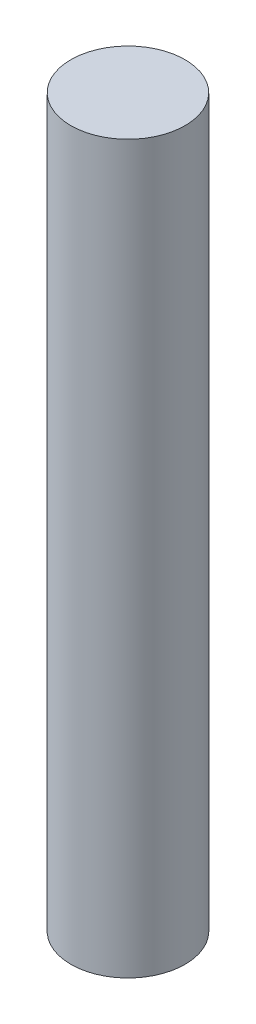
ISO-10303-21;
HEADER;
FILE_DESCRIPTION(('STEP AP214'),'2;1');
FILE_NAME('part.step','',(''),(''),'','','');
FILE_SCHEMA(('AUTOMOTIVE_DESIGN { 1 0 10303 214 1 1 1 1 }'));
ENDSEC;
DATA;
#1=APPLICATION_CONTEXT('core data for automotive mechanical design processes');
#2=APPLICATION_PROTOCOL_DEFINITION('international standard','automotive_design',2000,#1);
#3=PRODUCT_CONTEXT('',#1,'mechanical');
#4=PRODUCT('Part','Part','',(#3));
#5=PRODUCT_RELATED_PRODUCT_CATEGORY('part','',(#4));
#6=PRODUCT_DEFINITION_FORMATION('','',#4);
#7=PRODUCT_DEFINITION_CONTEXT('part definition',#1,'design');
#8=PRODUCT_DEFINITION('design','',#6,#7);
#9=PRODUCT_DEFINITION_SHAPE('','',#8);
#10=(LENGTH_UNIT() NAMED_UNIT(*) SI_UNIT(.MILLI.,.METRE.));
#11=(NAMED_UNIT(*) PLANE_ANGLE_UNIT() SI_UNIT($,.RADIAN.));
#12=(NAMED_UNIT(*) SI_UNIT($,.STERADIAN.) SOLID_ANGLE_UNIT());
#13=UNCERTAINTY_MEASURE_WITH_UNIT(LENGTH_MEASURE(1.E-05),#10,'distance_accuracy_value','');
#14=(GEOMETRIC_REPRESENTATION_CONTEXT(3) GLOBAL_UNCERTAINTY_ASSIGNED_CONTEXT((#13)) GLOBAL_UNIT_ASSIGNED_CONTEXT((#10,
#11,#12)) REPRESENTATION_CONTEXT('',''));
#15=CARTESIAN_POINT('',(0.,0.,0.));
#16=DIRECTION('',(0.,0.,1.));
#17=DIRECTION('',(1.,0.,0.));
#18=AXIS2_PLACEMENT_3D('',#15,#16,#17);
#19=CARTESIAN_POINT('',(0.,40.3646295521851,0.));
#20=DIRECTION('',(0.,-1.,0.));
#21=DIRECTION('',(0.,0.,-1.));
#22=AXIS2_PLACEMENT_3D('',#19,#20,#21);
#23=CYLINDRICAL_SURFACE('',#22,3.175);
#24=CARTESIAN_POINT('',(0.,40.3646295521851,0.));
#25=DIRECTION('',(0.,1.,0.));
#26=DIRECTION('',(0.,0.,1.));
#27=AXIS2_PLACEMENT_3D('',#24,#25,#26);
#28=CIRCLE('',#27,3.175);
#29=CARTESIAN_POINT('',(0.,40.3646295521851,3.175));
#30=VERTEX_POINT('',#29);
#31=EDGE_CURVE('E10',#30,#30,#28,.T.);
#32=ORIENTED_EDGE('',*,*,#31,.F.);
#33=EDGE_LOOP('',(#32));
#34=FACE_BOUND('',#33,.T.);
#35=CARTESIAN_POINT('',(0.,0.,0.));
#36=DIRECTION('',(0.,1.,0.));
#37=DIRECTION('',(0.,0.,1.));
#38=AXIS2_PLACEMENT_3D('',#35,#36,#37);
#39=CIRCLE('',#38,3.175);
#40=CARTESIAN_POINT('',(0.,0.,3.175));
#41=VERTEX_POINT('',#40);
#42=EDGE_CURVE('E34',#41,#41,#39,.T.);
#43=ORIENTED_EDGE('',*,*,#42,.T.);
#44=EDGE_LOOP('',(#43));
#45=FACE_BOUND('',#44,.T.);
#46=ADVANCED_FACE('F31',(#34,#45),#23,.T.);
#47=CARTESIAN_POINT('',(0.,40.3646295521851,0.));
#48=DIRECTION('',(0.,1.,0.));
#49=DIRECTION('',(0.,0.,1.));
#50=AXIS2_PLACEMENT_3D('',#47,#48,#49);
#51=PLANE('',#50);
#52=ORIENTED_EDGE('',*,*,#31,.T.);
#53=EDGE_LOOP('',(#52));
#54=FACE_BOUND('',#53,.T.);
#55=ADVANCED_FACE('F46',(#54),#51,.T.);
#56=CARTESIAN_POINT('',(0.,0.,0.));
#57=DIRECTION('',(0.,1.,0.));
#58=DIRECTION('',(0.,0.,1.));
#59=AXIS2_PLACEMENT_3D('',#56,#57,#58);
#60=PLANE('',#59);
#61=ORIENTED_EDGE('',*,*,#42,.F.);
#62=EDGE_LOOP('',(#61));
#63=FACE_BOUND('',#62,.T.);
#64=ADVANCED_FACE('F44',(#63),#60,.F.);
#65=CLOSED_SHELL('',(#46,#55,#64));
#66=MANIFOLD_SOLID_BREP('B2',#65);
#67=ADVANCED_BREP_SHAPE_REPRESENTATION('',(#18,#66),#14);
#68=SHAPE_DEFINITION_REPRESENTATION(#9,#67);
ENDSEC;
END-ISO-10303-21;
